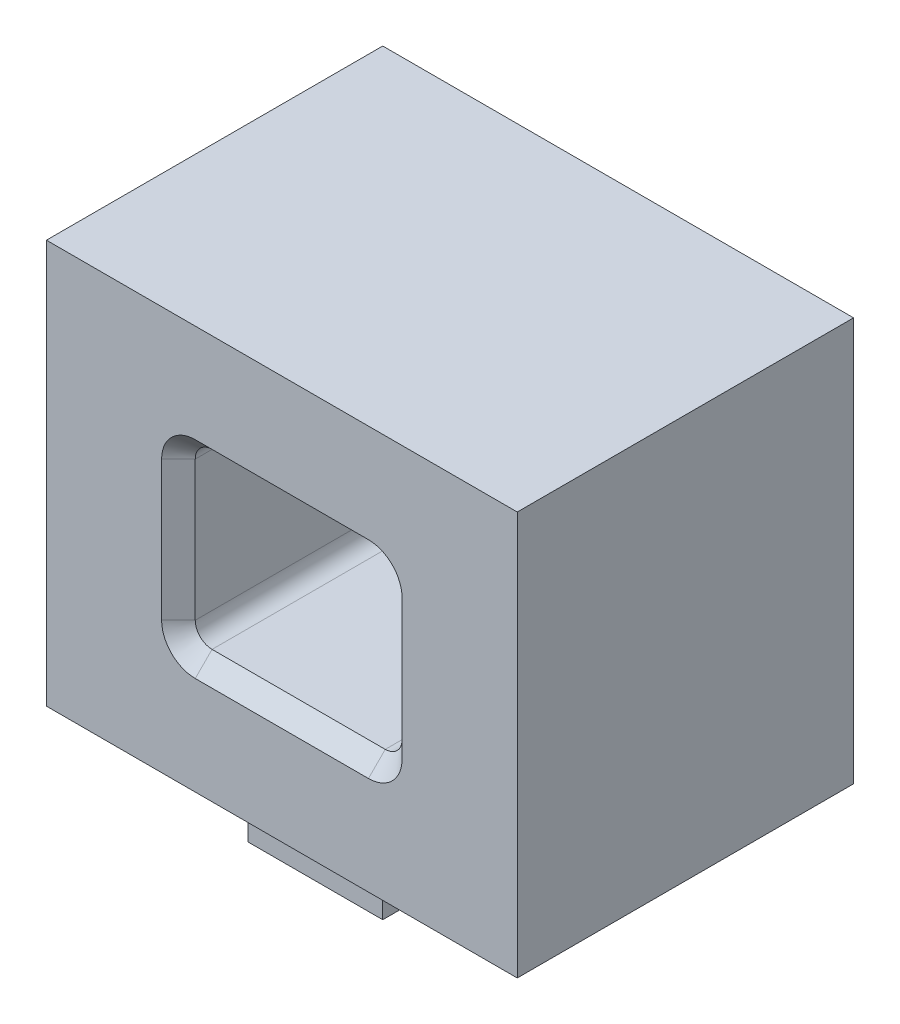
ISO-10303-21;
HEADER;
FILE_DESCRIPTION(('STEP AP214'),'2;1');
FILE_NAME('part.step','',(''),(''),'','','');
FILE_SCHEMA(('AUTOMOTIVE_DESIGN { 1 0 10303 214 1 1 1 1 }'));
ENDSEC;
DATA;
#1=APPLICATION_CONTEXT('core data for automotive mechanical design processes');
#2=APPLICATION_PROTOCOL_DEFINITION('international standard','automotive_design',2000,#1);
#3=PRODUCT_CONTEXT('',#1,'mechanical');
#4=PRODUCT('Part','Part','',(#3));
#5=PRODUCT_RELATED_PRODUCT_CATEGORY('part','',(#4));
#6=PRODUCT_DEFINITION_FORMATION('','',#4);
#7=PRODUCT_DEFINITION_CONTEXT('part definition',#1,'design');
#8=PRODUCT_DEFINITION('design','',#6,#7);
#9=PRODUCT_DEFINITION_SHAPE('','',#8);
#10=(LENGTH_UNIT() NAMED_UNIT(*) SI_UNIT(.MILLI.,.METRE.));
#11=(NAMED_UNIT(*) PLANE_ANGLE_UNIT() SI_UNIT($,.RADIAN.));
#12=(NAMED_UNIT(*) SI_UNIT($,.STERADIAN.) SOLID_ANGLE_UNIT());
#13=UNCERTAINTY_MEASURE_WITH_UNIT(LENGTH_MEASURE(1.E-05),#10,'distance_accuracy_value','');
#14=(GEOMETRIC_REPRESENTATION_CONTEXT(3) GLOBAL_UNCERTAINTY_ASSIGNED_CONTEXT((#13)) GLOBAL_UNIT_ASSIGNED_CONTEXT((#10,
#11,#12)) REPRESENTATION_CONTEXT('',''));
#15=CARTESIAN_POINT('',(0.,0.,0.));
#16=DIRECTION('',(0.,0.,1.));
#17=DIRECTION('',(1.,0.,0.));
#18=AXIS2_PLACEMENT_3D('',#15,#16,#17);
#19=CARTESIAN_POINT('',(0.,0.,20.));
#20=DIRECTION('',(0.,0.,-1.));
#21=DIRECTION('',(-1.,0.,0.));
#22=AXIS2_PLACEMENT_3D('',#19,#20,#21);
#23=PLANE('',#22);
#24=CARTESIAN_POINT('',(-5.15,4.15,20.));
#25=DIRECTION('',(0.,0.,-1.));
#26=DIRECTION('',(-1.,0.,0.));
#27=AXIS2_PLACEMENT_3D('',#24,#25,#26);
#28=CIRCLE('',#27,2.00000000000001);
#29=CARTESIAN_POINT('',(-7.15000000000001,4.15,20.));
#30=VERTEX_POINT('',#29);
#31=CARTESIAN_POINT('',(-5.15,6.15000000000001,20.));
#32=VERTEX_POINT('',#31);
#33=EDGE_CURVE('E368',#30,#32,#28,.T.);
#34=ORIENTED_EDGE('',*,*,#33,.T.);
#35=DIRECTION('',(1.,0.,0.));
#36=VECTOR('',#35,1.);
#37=CARTESIAN_POINT('',(5.15,6.15000000000001,20.));
#38=LINE('',#37,#36);
#39=CARTESIAN_POINT('',(5.15,6.15000000000001,20.));
#40=VERTEX_POINT('',#39);
#41=EDGE_CURVE('E366',#32,#40,#38,.T.);
#42=ORIENTED_EDGE('',*,*,#41,.T.);
#43=CARTESIAN_POINT('',(5.15,4.15,20.));
#44=DIRECTION('',(0.,0.,-1.));
#45=DIRECTION('',(-1.,0.,0.));
#46=AXIS2_PLACEMENT_3D('',#43,#44,#45);
#47=CIRCLE('',#46,2.00000000000001);
#48=CARTESIAN_POINT('',(7.15000000000001,4.15,20.));
#49=VERTEX_POINT('',#48);
#50=EDGE_CURVE('E365',#40,#49,#47,.T.);
#51=ORIENTED_EDGE('',*,*,#50,.T.);
#52=DIRECTION('',(0.,-1.,0.));
#53=VECTOR('',#52,1.);
#54=CARTESIAN_POINT('',(7.15000000000001,0.,20.));
#55=LINE('',#54,#53);
#56=CARTESIAN_POINT('',(7.15000000000001,-4.15,20.));
#57=VERTEX_POINT('',#56);
#58=EDGE_CURVE('E356',#49,#57,#55,.T.);
#59=ORIENTED_EDGE('',*,*,#58,.T.);
#60=CARTESIAN_POINT('',(5.15,-4.15,20.));
#61=DIRECTION('',(0.,0.,-1.));
#62=DIRECTION('',(-1.,0.,0.));
#63=AXIS2_PLACEMENT_3D('',#60,#61,#62);
#64=CIRCLE('',#63,2.00000000000001);
#65=CARTESIAN_POINT('',(5.15,-6.15000000000001,20.));
#66=VERTEX_POINT('',#65);
#67=EDGE_CURVE('E357',#57,#66,#64,.T.);
#68=ORIENTED_EDGE('',*,*,#67,.T.);
#69=DIRECTION('',(-1.,0.,0.));
#70=VECTOR('',#69,1.);
#71=CARTESIAN_POINT('',(0.,-6.15000000000001,20.));
#72=LINE('',#71,#70);
#73=CARTESIAN_POINT('',(-5.15,-6.15000000000001,20.));
#74=VERTEX_POINT('',#73);
#75=EDGE_CURVE('E353',#66,#74,#72,.T.);
#76=ORIENTED_EDGE('',*,*,#75,.T.);
#77=CARTESIAN_POINT('',(-5.15,-4.15,20.));
#78=DIRECTION('',(0.,0.,-1.));
#79=DIRECTION('',(-1.,0.,0.));
#80=AXIS2_PLACEMENT_3D('',#77,#78,#79);
#81=CIRCLE('',#80,2.00000000000001);
#82=CARTESIAN_POINT('',(-7.15000000000001,-4.15,20.));
#83=VERTEX_POINT('',#82);
#84=EDGE_CURVE('E358',#74,#83,#81,.T.);
#85=ORIENTED_EDGE('',*,*,#84,.T.);
#86=DIRECTION('',(0.,1.,0.));
#87=VECTOR('',#86,1.);
#88=CARTESIAN_POINT('',(-7.15000000000001,4.15,20.));
#89=LINE('',#88,#87);
#90=EDGE_CURVE('E362',#83,#30,#89,.T.);
#91=ORIENTED_EDGE('',*,*,#90,.T.);
#92=EDGE_LOOP('',(#34,#42,#51,#59,#68,#76,#85,#91));
#93=FACE_BOUND('',#92,.T.);
#94=DIRECTION('',(0.,1.,0.));
#95=VECTOR('',#94,1.);
#96=CARTESIAN_POINT('',(14.,-12.,20.));
#97=LINE('',#96,#95);
#98=CARTESIAN_POINT('',(14.,-12.,20.));
#99=VERTEX_POINT('',#98);
#100=CARTESIAN_POINT('',(14.,12.,20.));
#101=VERTEX_POINT('',#100);
#102=EDGE_CURVE('E296',#99,#101,#97,.T.);
#103=ORIENTED_EDGE('',*,*,#102,.T.);
#104=DIRECTION('',(-1.,0.,0.));
#105=VECTOR('',#104,1.);
#106=CARTESIAN_POINT('',(-14.,12.,20.));
#107=LINE('',#106,#105);
#108=CARTESIAN_POINT('',(-14.,12.,20.));
#109=VERTEX_POINT('',#108);
#110=EDGE_CURVE('E297',#101,#109,#107,.T.);
#111=ORIENTED_EDGE('',*,*,#110,.T.);
#112=DIRECTION('',(0.,-1.,0.));
#113=VECTOR('',#112,1.);
#114=CARTESIAN_POINT('',(-14.,-12.,20.));
#115=LINE('',#114,#113);
#116=CARTESIAN_POINT('',(-14.,-12.,20.));
#117=VERTEX_POINT('',#116);
#118=EDGE_CURVE('E303',#109,#117,#115,.T.);
#119=ORIENTED_EDGE('',*,*,#118,.T.);
#120=DIRECTION('',(1.,0.,0.));
#121=VECTOR('',#120,1.);
#122=CARTESIAN_POINT('',(-14.,-12.,20.));
#123=LINE('',#122,#121);
#124=EDGE_CURVE('E301',#117,#99,#123,.T.);
#125=ORIENTED_EDGE('',*,*,#124,.T.);
#126=EDGE_LOOP('',(#103,#111,#119,#125));
#127=FACE_BOUND('',#126,.T.);
#128=ADVANCED_FACE('F41',(#93,#127),#23,.F.);
#129=CARTESIAN_POINT('',(14.,-12.,20.));
#130=DIRECTION('',(-1.,0.,0.));
#131=DIRECTION('',(0.,0.,1.));
#132=AXIS2_PLACEMENT_3D('',#129,#130,#131);
#133=PLANE('',#132);
#134=DIRECTION('',(0.,1.,0.));
#135=VECTOR('',#134,1.);
#136=CARTESIAN_POINT('',(14.,-12.,0.));
#137=LINE('',#136,#135);
#138=CARTESIAN_POINT('',(14.,-12.,0.));
#139=VERTEX_POINT('',#138);
#140=CARTESIAN_POINT('',(14.,12.,0.));
#141=VERTEX_POINT('',#140);
#142=EDGE_CURVE('E299',#139,#141,#137,.T.);
#143=ORIENTED_EDGE('',*,*,#142,.T.);
#144=DIRECTION('',(0.,0.,-1.));
#145=VECTOR('',#144,1.);
#146=CARTESIAN_POINT('',(14.,12.,20.));
#147=LINE('',#146,#145);
#148=EDGE_CURVE('E323',#101,#141,#147,.T.);
#149=ORIENTED_EDGE('',*,*,#148,.F.);
#150=ORIENTED_EDGE('',*,*,#102,.F.);
#151=DIRECTION('',(0.,0.,-1.));
#152=VECTOR('',#151,1.);
#153=CARTESIAN_POINT('',(14.,-12.,20.));
#154=LINE('',#153,#152);
#155=EDGE_CURVE('E307',#99,#139,#154,.T.);
#156=ORIENTED_EDGE('',*,*,#155,.T.);
#157=EDGE_LOOP('',(#143,#149,#150,#156));
#158=FACE_BOUND('',#157,.T.);
#159=ADVANCED_FACE('F483',(#158),#133,.F.);
#160=CARTESIAN_POINT('',(-14.,12.,20.));
#161=DIRECTION('',(0.,-1.,0.));
#162=DIRECTION('',(0.,0.,-1.));
#163=AXIS2_PLACEMENT_3D('',#160,#161,#162);
#164=PLANE('',#163);
#165=DIRECTION('',(-1.,0.,0.));
#166=VECTOR('',#165,1.);
#167=CARTESIAN_POINT('',(-14.,12.,0.));
#168=LINE('',#167,#166);
#169=CARTESIAN_POINT('',(-14.,12.,0.));
#170=VERTEX_POINT('',#169);
#171=EDGE_CURVE('E309',#141,#170,#168,.T.);
#172=ORIENTED_EDGE('',*,*,#171,.T.);
#173=DIRECTION('',(0.,0.,-1.));
#174=VECTOR('',#173,1.);
#175=CARTESIAN_POINT('',(-14.,12.,20.));
#176=LINE('',#175,#174);
#177=EDGE_CURVE('E319',#109,#170,#176,.T.);
#178=ORIENTED_EDGE('',*,*,#177,.F.);
#179=ORIENTED_EDGE('',*,*,#110,.F.);
#180=ORIENTED_EDGE('',*,*,#148,.T.);
#181=EDGE_LOOP('',(#172,#178,#179,#180));
#182=FACE_BOUND('',#181,.T.);
#183=ADVANCED_FACE('F491',(#182),#164,.F.);
#184=CARTESIAN_POINT('',(-14.,-12.,20.));
#185=DIRECTION('',(1.,0.,0.));
#186=DIRECTION('',(0.,0.,-1.));
#187=AXIS2_PLACEMENT_3D('',#184,#185,#186);
#188=PLANE('',#187);
#189=DIRECTION('',(0.,-1.,0.));
#190=VECTOR('',#189,1.);
#191=CARTESIAN_POINT('',(-14.,-12.,0.));
#192=LINE('',#191,#190);
#193=CARTESIAN_POINT('',(-14.,-12.,0.));
#194=VERTEX_POINT('',#193);
#195=EDGE_CURVE('E315',#170,#194,#192,.T.);
#196=ORIENTED_EDGE('',*,*,#195,.T.);
#197=DIRECTION('',(0.,0.,-1.));
#198=VECTOR('',#197,1.);
#199=CARTESIAN_POINT('',(-14.,-12.,20.));
#200=LINE('',#199,#198);
#201=EDGE_CURVE('E320',#117,#194,#200,.T.);
#202=ORIENTED_EDGE('',*,*,#201,.F.);
#203=ORIENTED_EDGE('',*,*,#118,.F.);
#204=ORIENTED_EDGE('',*,*,#177,.T.);
#205=EDGE_LOOP('',(#196,#202,#203,#204));
#206=FACE_BOUND('',#205,.T.);
#207=ADVANCED_FACE('F502',(#206),#188,.F.);
#208=CARTESIAN_POINT('',(-14.,-12.,20.));
#209=DIRECTION('',(0.,1.,0.));
#210=DIRECTION('',(0.,0.,1.));
#211=AXIS2_PLACEMENT_3D('',#208,#209,#210);
#212=PLANE('',#211);
#213=DIRECTION('',(1.,0.,0.));
#214=VECTOR('',#213,1.);
#215=CARTESIAN_POINT('',(-4.,-12.,0.999999999999998));
#216=LINE('',#215,#214);
#217=CARTESIAN_POINT('',(5.,-12.,0.999999999999998));
#218=VERTEX_POINT('',#217);
#219=CARTESIAN_POINT('',(-5.,-12.,0.999999999999998));
#220=VERTEX_POINT('',#219);
#221=EDGE_CURVE('E424',#218,#220,#216,.F.);
#222=ORIENTED_EDGE('',*,*,#221,.T.);
#223=DIRECTION('',(0.,0.,-1.));
#224=VECTOR('',#223,1.);
#225=CARTESIAN_POINT('',(-5.,-12.,8.));
#226=LINE('',#225,#224);
#227=CARTESIAN_POINT('',(-5.,-12.,9.));
#228=VERTEX_POINT('',#227);
#229=EDGE_CURVE('E428',#220,#228,#226,.F.);
#230=ORIENTED_EDGE('',*,*,#229,.T.);
#231=DIRECTION('',(-1.,0.,0.));
#232=VECTOR('',#231,1.);
#233=CARTESIAN_POINT('',(4.,-12.,9.));
#234=LINE('',#233,#232);
#235=CARTESIAN_POINT('',(5.,-12.,9.));
#236=VERTEX_POINT('',#235);
#237=EDGE_CURVE('E426',#228,#236,#234,.F.);
#238=ORIENTED_EDGE('',*,*,#237,.T.);
#239=DIRECTION('',(0.,0.,1.));
#240=VECTOR('',#239,1.);
#241=CARTESIAN_POINT('',(5.,-12.,2.));
#242=LINE('',#241,#240);
#243=EDGE_CURVE('E425',#236,#218,#242,.F.);
#244=ORIENTED_EDGE('',*,*,#243,.T.);
#245=EDGE_LOOP('',(#222,#230,#238,#244));
#246=FACE_BOUND('',#245,.T.);
#247=DIRECTION('',(-1.,0.,0.));
#248=VECTOR('',#247,1.);
#249=CARTESIAN_POINT('',(4.,-12.,19.));
#250=LINE('',#249,#248);
#251=CARTESIAN_POINT('',(-5.,-12.,19.));
#252=VERTEX_POINT('',#251);
#253=CARTESIAN_POINT('',(5.,-12.,19.));
#254=VERTEX_POINT('',#253);
#255=EDGE_CURVE('E413',#252,#254,#250,.F.);
#256=ORIENTED_EDGE('',*,*,#255,.T.);
#257=DIRECTION('',(0.,0.,1.));
#258=VECTOR('',#257,1.);
#259=CARTESIAN_POINT('',(5.,-12.,12.));
#260=LINE('',#259,#258);
#261=CARTESIAN_POINT('',(5.,-12.,11.));
#262=VERTEX_POINT('',#261);
#263=EDGE_CURVE('E420',#254,#262,#260,.F.);
#264=ORIENTED_EDGE('',*,*,#263,.T.);
#265=DIRECTION('',(1.,0.,0.));
#266=VECTOR('',#265,1.);
#267=CARTESIAN_POINT('',(-4.,-12.,11.));
#268=LINE('',#267,#266);
#269=CARTESIAN_POINT('',(-5.,-12.,11.));
#270=VERTEX_POINT('',#269);
#271=EDGE_CURVE('E417',#262,#270,#268,.F.);
#272=ORIENTED_EDGE('',*,*,#271,.T.);
#273=DIRECTION('',(0.,0.,-1.));
#274=VECTOR('',#273,1.);
#275=CARTESIAN_POINT('',(-5.,-12.,18.));
#276=LINE('',#275,#274);
#277=EDGE_CURVE('E411',#270,#252,#276,.F.);
#278=ORIENTED_EDGE('',*,*,#277,.T.);
#279=EDGE_LOOP('',(#256,#264,#272,#278));
#280=FACE_BOUND('',#279,.T.);
#281=DIRECTION('',(1.,0.,0.));
#282=VECTOR('',#281,1.);
#283=CARTESIAN_POINT('',(-14.,-12.,0.));
#284=LINE('',#283,#282);
#285=EDGE_CURVE('E302',#194,#139,#284,.T.);
#286=ORIENTED_EDGE('',*,*,#285,.T.);
#287=ORIENTED_EDGE('',*,*,#155,.F.);
#288=ORIENTED_EDGE('',*,*,#124,.F.);
#289=ORIENTED_EDGE('',*,*,#201,.T.);
#290=EDGE_LOOP('',(#286,#287,#288,#289));
#291=FACE_BOUND('',#290,.T.);
#292=ADVANCED_FACE('F468',(#246,#280,#291),#212,.F.);
#293=CARTESIAN_POINT('',(0.,0.,0.));
#294=DIRECTION('',(0.,0.,-1.));
#295=DIRECTION('',(-1.,0.,0.));
#296=AXIS2_PLACEMENT_3D('',#293,#294,#295);
#297=PLANE('',#296);
#298=ORIENTED_EDGE('',*,*,#142,.F.);
#299=ORIENTED_EDGE('',*,*,#285,.F.);
#300=ORIENTED_EDGE('',*,*,#195,.F.);
#301=ORIENTED_EDGE('',*,*,#171,.F.);
#302=EDGE_LOOP('',(#298,#299,#300,#301));
#303=FACE_BOUND('',#302,.T.);
#304=ADVANCED_FACE('F496',(#303),#297,.T.);
#305=CARTESIAN_POINT('',(-6.15,5.15,4.7));
#306=DIRECTION('',(0.,-1.,0.));
#307=DIRECTION('',(0.,0.,-1.));
#308=AXIS2_PLACEMENT_3D('',#305,#306,#307);
#309=PLANE('',#308);
#310=DIRECTION('',(0.,0.,1.));
#311=VECTOR('',#310,1.);
#312=CARTESIAN_POINT('',(5.15,5.15,4.7));
#313=LINE('',#312,#311);
#314=CARTESIAN_POINT('',(5.15,5.15,4.7));
#315=VERTEX_POINT('',#314);
#316=CARTESIAN_POINT('',(5.15,5.15,19.));
#317=VERTEX_POINT('',#316);
#318=EDGE_CURVE('E347',#315,#317,#313,.T.);
#319=ORIENTED_EDGE('',*,*,#318,.T.);
#320=DIRECTION('',(-1.,0.,0.));
#321=VECTOR('',#320,1.);
#322=CARTESIAN_POINT('',(-5.15,5.15,19.));
#323=LINE('',#322,#321);
#324=CARTESIAN_POINT('',(-5.15,5.15,19.));
#325=VERTEX_POINT('',#324);
#326=EDGE_CURVE('E371',#317,#325,#323,.T.);
#327=ORIENTED_EDGE('',*,*,#326,.T.);
#328=DIRECTION('',(0.,0.,1.));
#329=VECTOR('',#328,1.);
#330=CARTESIAN_POINT('',(-5.15,5.15,4.7));
#331=LINE('',#330,#329);
#332=CARTESIAN_POINT('',(-5.15,5.15,4.7));
#333=VERTEX_POINT('',#332);
#334=EDGE_CURVE('E344',#325,#333,#331,.F.);
#335=ORIENTED_EDGE('',*,*,#334,.T.);
#336=DIRECTION('',(1.,0.,0.));
#337=VECTOR('',#336,1.);
#338=CARTESIAN_POINT('',(-6.15,5.15,4.7));
#339=LINE('',#338,#337);
#340=EDGE_CURVE('E246',#333,#315,#339,.T.);
#341=ORIENTED_EDGE('',*,*,#340,.T.);
#342=EDGE_LOOP('',(#319,#327,#335,#341));
#343=FACE_BOUND('',#342,.T.);
#344=ADVANCED_FACE('F500',(#343),#309,.T.);
#345=CARTESIAN_POINT('',(6.15,-5.15,4.7));
#346=DIRECTION('',(1.,0.,0.));
#347=DIRECTION('',(0.,0.,-1.));
#348=AXIS2_PLACEMENT_3D('',#345,#346,#347);
#349=PLANE('',#348);
#350=DIRECTION('',(0.,0.,1.));
#351=VECTOR('',#350,1.);
#352=CARTESIAN_POINT('',(6.15,-4.15,20.));
#353=LINE('',#352,#351);
#354=CARTESIAN_POINT('',(6.15,-4.15,4.7));
#355=VERTEX_POINT('',#354);
#356=CARTESIAN_POINT('',(6.15,-4.15,19.));
#357=VERTEX_POINT('',#356);
#358=EDGE_CURVE('E327',#355,#357,#353,.T.);
#359=ORIENTED_EDGE('',*,*,#358,.T.);
#360=DIRECTION('',(0.,1.,0.));
#361=VECTOR('',#360,1.);
#362=CARTESIAN_POINT('',(6.15,-5.15,19.));
#363=LINE('',#362,#361);
#364=CARTESIAN_POINT('',(6.15,4.15,19.));
#365=VERTEX_POINT('',#364);
#366=EDGE_CURVE('E379',#357,#365,#363,.T.);
#367=ORIENTED_EDGE('',*,*,#366,.T.);
#368=DIRECTION('',(0.,0.,1.));
#369=VECTOR('',#368,1.);
#370=CARTESIAN_POINT('',(6.15,4.15,4.7));
#371=LINE('',#370,#369);
#372=CARTESIAN_POINT('',(6.15,4.15,4.7));
#373=VERTEX_POINT('',#372);
#374=EDGE_CURVE('E326',#365,#373,#371,.F.);
#375=ORIENTED_EDGE('',*,*,#374,.T.);
#376=DIRECTION('',(0.,1.,0.));
#377=VECTOR('',#376,1.);
#378=CARTESIAN_POINT('',(6.15,-5.15,4.7));
#379=LINE('',#378,#377);
#380=EDGE_CURVE('E251',#355,#373,#379,.T.);
#381=ORIENTED_EDGE('',*,*,#380,.F.);
#382=EDGE_LOOP('',(#359,#367,#375,#381));
#383=FACE_BOUND('',#382,.T.);
#384=ADVANCED_FACE('F665',(#383),#349,.F.);
#385=CARTESIAN_POINT('',(-6.15,-5.15,4.7));
#386=DIRECTION('',(0.,-1.,0.));
#387=DIRECTION('',(0.,0.,-1.));
#388=AXIS2_PLACEMENT_3D('',#385,#386,#387);
#389=PLANE('',#388);
#390=DIRECTION('',(0.,0.,1.));
#391=VECTOR('',#390,1.);
#392=CARTESIAN_POINT('',(-5.15,-5.15,4.7));
#393=LINE('',#392,#391);
#394=CARTESIAN_POINT('',(-5.15,-5.15,4.7));
#395=VERTEX_POINT('',#394);
#396=CARTESIAN_POINT('',(-5.15,-5.15,19.));
#397=VERTEX_POINT('',#396);
#398=EDGE_CURVE('E332',#395,#397,#393,.T.);
#399=ORIENTED_EDGE('',*,*,#398,.T.);
#400=DIRECTION('',(1.,0.,0.));
#401=VECTOR('',#400,1.);
#402=CARTESIAN_POINT('',(-6.15,-5.15,19.));
#403=LINE('',#402,#401);
#404=CARTESIAN_POINT('',(5.15,-5.15,19.));
#405=VERTEX_POINT('',#404);
#406=EDGE_CURVE('E387',#397,#405,#403,.T.);
#407=ORIENTED_EDGE('',*,*,#406,.T.);
#408=DIRECTION('',(0.,0.,1.));
#409=VECTOR('',#408,1.);
#410=CARTESIAN_POINT('',(5.15,-5.15,4.7));
#411=LINE('',#410,#409);
#412=CARTESIAN_POINT('',(5.15,-5.15,4.7));
#413=VERTEX_POINT('',#412);
#414=EDGE_CURVE('E331',#405,#413,#411,.F.);
#415=ORIENTED_EDGE('',*,*,#414,.T.);
#416=DIRECTION('',(1.,0.,0.));
#417=VECTOR('',#416,1.);
#418=CARTESIAN_POINT('',(-6.15,-5.15,4.7));
#419=LINE('',#418,#417);
#420=EDGE_CURVE('E286',#395,#413,#419,.T.);
#421=ORIENTED_EDGE('',*,*,#420,.F.);
#422=EDGE_LOOP('',(#399,#407,#415,#421));
#423=FACE_BOUND('',#422,.T.);
#424=ADVANCED_FACE('F658',(#423),#389,.F.);
#425=CARTESIAN_POINT('',(-6.15,-5.15,4.7));
#426=DIRECTION('',(1.,0.,0.));
#427=DIRECTION('',(0.,0.,-1.));
#428=AXIS2_PLACEMENT_3D('',#425,#426,#427);
#429=PLANE('',#428);
#430=DIRECTION('',(0.,0.,1.));
#431=VECTOR('',#430,1.);
#432=CARTESIAN_POINT('',(-6.15,4.15,20.));
#433=LINE('',#432,#431);
#434=CARTESIAN_POINT('',(-6.15,4.15,4.7));
#435=VERTEX_POINT('',#434);
#436=CARTESIAN_POINT('',(-6.15,4.15,19.));
#437=VERTEX_POINT('',#436);
#438=EDGE_CURVE('E354',#435,#437,#433,.T.);
#439=ORIENTED_EDGE('',*,*,#438,.T.);
#440=DIRECTION('',(0.,-1.,0.));
#441=VECTOR('',#440,1.);
#442=CARTESIAN_POINT('',(-6.15,-4.15,19.));
#443=LINE('',#442,#441);
#444=CARTESIAN_POINT('',(-6.15,-4.15,19.));
#445=VERTEX_POINT('',#444);
#446=EDGE_CURVE('E378',#437,#445,#443,.T.);
#447=ORIENTED_EDGE('',*,*,#446,.T.);
#448=DIRECTION('',(0.,0.,1.));
#449=VECTOR('',#448,1.);
#450=CARTESIAN_POINT('',(-6.15,-4.15,4.7));
#451=LINE('',#450,#449);
#452=CARTESIAN_POINT('',(-6.15,-4.15,4.7));
#453=VERTEX_POINT('',#452);
#454=EDGE_CURVE('E349',#445,#453,#451,.F.);
#455=ORIENTED_EDGE('',*,*,#454,.T.);
#456=DIRECTION('',(0.,1.,0.));
#457=VECTOR('',#456,1.);
#458=CARTESIAN_POINT('',(-6.15,-5.15,4.7));
#459=LINE('',#458,#457);
#460=EDGE_CURVE('E291',#453,#435,#459,.T.);
#461=ORIENTED_EDGE('',*,*,#460,.T.);
#462=EDGE_LOOP('',(#439,#447,#455,#461));
#463=FACE_BOUND('',#462,.T.);
#464=ADVANCED_FACE('F654',(#463),#429,.T.);
#465=CARTESIAN_POINT('',(0.,0.,4.7));
#466=DIRECTION('',(0.,0.,1.));
#467=DIRECTION('',(1.,0.,0.));
#468=AXIS2_PLACEMENT_3D('',#465,#466,#467);
#469=PLANE('',#468);
#470=ORIENTED_EDGE('',*,*,#420,.T.);
#471=CARTESIAN_POINT('',(5.15,-4.15,4.7));
#472=DIRECTION('',(0.,0.,1.));
#473=DIRECTION('',(1.,0.,0.));
#474=AXIS2_PLACEMENT_3D('',#471,#472,#473);
#475=CIRCLE('',#474,1.);
#476=EDGE_CURVE('E345',#413,#355,#475,.T.);
#477=ORIENTED_EDGE('',*,*,#476,.T.);
#478=ORIENTED_EDGE('',*,*,#380,.T.);
#479=CARTESIAN_POINT('',(5.15,4.15,4.7));
#480=DIRECTION('',(0.,0.,1.));
#481=DIRECTION('',(1.,0.,0.));
#482=AXIS2_PLACEMENT_3D('',#479,#480,#481);
#483=CIRCLE('',#482,1.);
#484=EDGE_CURVE('E337',#373,#315,#483,.T.);
#485=ORIENTED_EDGE('',*,*,#484,.T.);
#486=ORIENTED_EDGE('',*,*,#340,.F.);
#487=CARTESIAN_POINT('',(-5.15,4.15,4.7));
#488=DIRECTION('',(0.,0.,1.));
#489=DIRECTION('',(1.,0.,0.));
#490=AXIS2_PLACEMENT_3D('',#487,#488,#489);
#491=CIRCLE('',#490,1.);
#492=EDGE_CURVE('E340',#333,#435,#491,.T.);
#493=ORIENTED_EDGE('',*,*,#492,.T.);
#494=ORIENTED_EDGE('',*,*,#460,.F.);
#495=CARTESIAN_POINT('',(-5.15,-4.15,4.7));
#496=DIRECTION('',(0.,0.,1.));
#497=DIRECTION('',(1.,0.,0.));
#498=AXIS2_PLACEMENT_3D('',#495,#496,#497);
#499=CIRCLE('',#498,1.);
#500=EDGE_CURVE('E339',#453,#395,#499,.T.);
#501=ORIENTED_EDGE('',*,*,#500,.T.);
#502=EDGE_LOOP('',(#470,#477,#478,#485,#486,#493,#494,#501));
#503=FACE_BOUND('',#502,.T.);
#504=ADVANCED_FACE('F649',(#503),#469,.T.);
#505=CARTESIAN_POINT('',(0.,-15.,0.));
#506=DIRECTION('',(0.,-1.,0.));
#507=DIRECTION('',(0.,0.,-1.));
#508=AXIS2_PLACEMENT_3D('',#505,#506,#507);
#509=PLANE('',#508);
#510=DIRECTION('',(0.,0.,-1.));
#511=VECTOR('',#510,1.);
#512=CARTESIAN_POINT('',(-4.,-15.,8.));
#513=LINE('',#512,#511);
#514=CARTESIAN_POINT('',(-4.,-15.,8.));
#515=VERTEX_POINT('',#514);
#516=CARTESIAN_POINT('',(-4.,-15.,2.));
#517=VERTEX_POINT('',#516);
#518=EDGE_CURVE('E279',#515,#517,#513,.T.);
#519=ORIENTED_EDGE('',*,*,#518,.T.);
#520=DIRECTION('',(1.,0.,0.));
#521=VECTOR('',#520,1.);
#522=CARTESIAN_POINT('',(-4.,-15.,2.));
#523=LINE('',#522,#521);
#524=CARTESIAN_POINT('',(4.,-15.,2.));
#525=VERTEX_POINT('',#524);
#526=EDGE_CURVE('E277',#517,#525,#523,.T.);
#527=ORIENTED_EDGE('',*,*,#526,.T.);
#528=DIRECTION('',(0.,0.,1.));
#529=VECTOR('',#528,1.);
#530=CARTESIAN_POINT('',(4.,-15.,8.));
#531=LINE('',#530,#529);
#532=CARTESIAN_POINT('',(4.,-15.,8.));
#533=VERTEX_POINT('',#532);
#534=EDGE_CURVE('E273',#525,#533,#531,.T.);
#535=ORIENTED_EDGE('',*,*,#534,.T.);
#536=DIRECTION('',(-1.,0.,0.));
#537=VECTOR('',#536,1.);
#538=CARTESIAN_POINT('',(-4.,-15.,8.));
#539=LINE('',#538,#537);
#540=EDGE_CURVE('E275',#533,#515,#539,.T.);
#541=ORIENTED_EDGE('',*,*,#540,.T.);
#542=EDGE_LOOP('',(#519,#527,#535,#541));
#543=FACE_BOUND('',#542,.T.);
#544=CARTESIAN_POINT('',(0.,-15.,5.));
#545=DIRECTION('',(0.,-1.,0.));
#546=DIRECTION('',(0.,0.,1.));
#547=AXIS2_PLACEMENT_3D('',#544,#545,#546);
#548=CIRCLE('',#547,1.7);
#549=CARTESIAN_POINT('',(0.,-15.,6.7));
#550=VERTEX_POINT('',#549);
#551=EDGE_CURVE('E284',#550,#550,#548,.T.);
#552=ORIENTED_EDGE('',*,*,#551,.F.);
#553=EDGE_LOOP('',(#552));
#554=FACE_BOUND('',#553,.T.);
#555=ADVANCED_FACE('F626',(#543,#554),#509,.T.);
#556=CARTESIAN_POINT('',(-4.,-15.,8.));
#557=DIRECTION('',(1.,0.,0.));
#558=DIRECTION('',(0.,0.,-1.));
#559=AXIS2_PLACEMENT_3D('',#556,#557,#558);
#560=PLANE('',#559);
#561=DIRECTION('',(0.,1.,0.));
#562=VECTOR('',#561,1.);
#563=CARTESIAN_POINT('',(-4.,-15.,8.));
#564=LINE('',#563,#562);
#565=CARTESIAN_POINT('',(-4.,-13.,8.));
#566=VERTEX_POINT('',#565);
#567=EDGE_CURVE('E267',#515,#566,#564,.T.);
#568=ORIENTED_EDGE('',*,*,#567,.T.);
#569=DIRECTION('',(0.,0.,-1.));
#570=VECTOR('',#569,1.);
#571=CARTESIAN_POINT('',(-4.,-13.,2.));
#572=LINE('',#571,#570);
#573=CARTESIAN_POINT('',(-4.,-13.,2.));
#574=VERTEX_POINT('',#573);
#575=EDGE_CURVE('E389',#566,#574,#572,.T.);
#576=ORIENTED_EDGE('',*,*,#575,.T.);
#577=DIRECTION('',(0.,1.,0.));
#578=VECTOR('',#577,1.);
#579=CARTESIAN_POINT('',(-4.,-15.,2.));
#580=LINE('',#579,#578);
#581=EDGE_CURVE('E259',#517,#574,#580,.T.);
#582=ORIENTED_EDGE('',*,*,#581,.F.);
#583=ORIENTED_EDGE('',*,*,#518,.F.);
#584=EDGE_LOOP('',(#568,#576,#582,#583));
#585=FACE_BOUND('',#584,.T.);
#586=ADVANCED_FACE('F624',(#585),#560,.F.);
#587=CARTESIAN_POINT('',(-4.,-15.,2.));
#588=DIRECTION('',(0.,0.,1.));
#589=DIRECTION('',(1.,0.,0.));
#590=AXIS2_PLACEMENT_3D('',#587,#588,#589);
#591=PLANE('',#590);
#592=ORIENTED_EDGE('',*,*,#581,.T.);
#593=DIRECTION('',(1.,0.,0.));
#594=VECTOR('',#593,1.);
#595=CARTESIAN_POINT('',(4.,-13.,2.));
#596=LINE('',#595,#594);
#597=CARTESIAN_POINT('',(4.,-13.,2.));
#598=VERTEX_POINT('',#597);
#599=EDGE_CURVE('E433',#574,#598,#596,.T.);
#600=ORIENTED_EDGE('',*,*,#599,.T.);
#601=DIRECTION('',(0.,1.,0.));
#602=VECTOR('',#601,1.);
#603=CARTESIAN_POINT('',(4.,-15.,2.));
#604=LINE('',#603,#602);
#605=EDGE_CURVE('E265',#525,#598,#604,.T.);
#606=ORIENTED_EDGE('',*,*,#605,.F.);
#607=ORIENTED_EDGE('',*,*,#526,.F.);
#608=EDGE_LOOP('',(#592,#600,#606,#607));
#609=FACE_BOUND('',#608,.T.);
#610=ADVANCED_FACE('F634',(#609),#591,.F.);
#611=CARTESIAN_POINT('',(4.,-15.,8.));
#612=DIRECTION('',(-1.,0.,0.));
#613=DIRECTION('',(0.,0.,1.));
#614=AXIS2_PLACEMENT_3D('',#611,#612,#613);
#615=PLANE('',#614);
#616=ORIENTED_EDGE('',*,*,#605,.T.);
#617=DIRECTION('',(0.,0.,1.));
#618=VECTOR('',#617,1.);
#619=CARTESIAN_POINT('',(4.,-13.,8.));
#620=LINE('',#619,#618);
#621=CARTESIAN_POINT('',(4.,-13.,8.));
#622=VERTEX_POINT('',#621);
#623=EDGE_CURVE('E434',#598,#622,#620,.T.);
#624=ORIENTED_EDGE('',*,*,#623,.T.);
#625=DIRECTION('',(0.,1.,0.));
#626=VECTOR('',#625,1.);
#627=CARTESIAN_POINT('',(4.,-15.,8.));
#628=LINE('',#627,#626);
#629=EDGE_CURVE('E266',#533,#622,#628,.T.);
#630=ORIENTED_EDGE('',*,*,#629,.F.);
#631=ORIENTED_EDGE('',*,*,#534,.F.);
#632=EDGE_LOOP('',(#616,#624,#630,#631));
#633=FACE_BOUND('',#632,.T.);
#634=ADVANCED_FACE('F635',(#633),#615,.F.);
#635=CARTESIAN_POINT('',(-4.,-15.,8.));
#636=DIRECTION('',(0.,0.,-1.));
#637=DIRECTION('',(-1.,0.,0.));
#638=AXIS2_PLACEMENT_3D('',#635,#636,#637);
#639=PLANE('',#638);
#640=ORIENTED_EDGE('',*,*,#629,.T.);
#641=DIRECTION('',(-1.,0.,0.));
#642=VECTOR('',#641,1.);
#643=CARTESIAN_POINT('',(-4.,-13.,8.));
#644=LINE('',#643,#642);
#645=EDGE_CURVE('E431',#622,#566,#644,.T.);
#646=ORIENTED_EDGE('',*,*,#645,.T.);
#647=ORIENTED_EDGE('',*,*,#567,.F.);
#648=ORIENTED_EDGE('',*,*,#540,.F.);
#649=EDGE_LOOP('',(#640,#646,#647,#648));
#650=FACE_BOUND('',#649,.T.);
#651=ADVANCED_FACE('F619',(#650),#639,.F.);
#652=CARTESIAN_POINT('',(0.,-15.,5.));
#653=DIRECTION('',(0.,1.,0.));
#654=DIRECTION('',(0.,0.,1.));
#655=AXIS2_PLACEMENT_3D('',#652,#653,#654);
#656=CYLINDRICAL_SURFACE('',#655,1.7);
#657=ORIENTED_EDGE('',*,*,#551,.T.);
#658=EDGE_LOOP('',(#657));
#659=FACE_BOUND('',#658,.T.);
#660=CARTESIAN_POINT('',(0.,-12.,5.));
#661=DIRECTION('',(0.,-1.,0.));
#662=DIRECTION('',(0.,0.,1.));
#663=AXIS2_PLACEMENT_3D('',#660,#661,#662);
#664=CIRCLE('',#663,1.7);
#665=CARTESIAN_POINT('',(0.,-12.,6.7));
#666=VERTEX_POINT('',#665);
#667=EDGE_CURVE('E281',#666,#666,#664,.T.);
#668=ORIENTED_EDGE('',*,*,#667,.F.);
#669=EDGE_LOOP('',(#668));
#670=FACE_BOUND('',#669,.T.);
#671=ADVANCED_FACE('F650',(#659,#670),#656,.F.);
#672=CARTESIAN_POINT('',(0.,-15.,0.));
#673=DIRECTION('',(0.,1.,0.));
#674=DIRECTION('',(0.,0.,1.));
#675=AXIS2_PLACEMENT_3D('',#672,#673,#674);
#676=PLANE('',#675);
#677=DIRECTION('',(0.,0.,1.));
#678=VECTOR('',#677,1.);
#679=CARTESIAN_POINT('',(4.,-15.,12.));
#680=LINE('',#679,#678);
#681=CARTESIAN_POINT('',(4.,-15.,12.));
#682=VERTEX_POINT('',#681);
#683=CARTESIAN_POINT('',(4.,-15.,18.));
#684=VERTEX_POINT('',#683);
#685=EDGE_CURVE('E234',#682,#684,#680,.T.);
#686=ORIENTED_EDGE('',*,*,#685,.T.);
#687=DIRECTION('',(-1.,0.,0.));
#688=VECTOR('',#687,1.);
#689=CARTESIAN_POINT('',(-4.,-15.,18.));
#690=LINE('',#689,#688);
#691=CARTESIAN_POINT('',(-4.,-15.,18.));
#692=VERTEX_POINT('',#691);
#693=EDGE_CURVE('E223',#684,#692,#690,.T.);
#694=ORIENTED_EDGE('',*,*,#693,.T.);
#695=DIRECTION('',(0.,0.,-1.));
#696=VECTOR('',#695,1.);
#697=CARTESIAN_POINT('',(-4.,-15.,12.));
#698=LINE('',#697,#696);
#699=CARTESIAN_POINT('',(-4.,-15.,12.));
#700=VERTEX_POINT('',#699);
#701=EDGE_CURVE('E233',#692,#700,#698,.T.);
#702=ORIENTED_EDGE('',*,*,#701,.T.);
#703=DIRECTION('',(1.,0.,0.));
#704=VECTOR('',#703,1.);
#705=CARTESIAN_POINT('',(-4.,-15.,12.));
#706=LINE('',#705,#704);
#707=EDGE_CURVE('E238',#700,#682,#706,.T.);
#708=ORIENTED_EDGE('',*,*,#707,.T.);
#709=EDGE_LOOP('',(#686,#694,#702,#708));
#710=FACE_BOUND('',#709,.T.);
#711=CARTESIAN_POINT('',(0.,-15.,15.));
#712=DIRECTION('',(0.,-1.,0.));
#713=DIRECTION('',(0.,0.,-1.));
#714=AXIS2_PLACEMENT_3D('',#711,#712,#713);
#715=CIRCLE('',#714,1.7);
#716=CARTESIAN_POINT('',(0.,-15.,13.3));
#717=VERTEX_POINT('',#716);
#718=EDGE_CURVE('E243',#717,#717,#715,.T.);
#719=ORIENTED_EDGE('',*,*,#718,.F.);
#720=EDGE_LOOP('',(#719));
#721=FACE_BOUND('',#720,.T.);
#722=ADVANCED_FACE('F240',(#710,#721),#676,.F.);
#723=CARTESIAN_POINT('',(4.,-15.,12.));
#724=DIRECTION('',(-1.,0.,0.));
#725=DIRECTION('',(0.,0.,1.));
#726=AXIS2_PLACEMENT_3D('',#723,#724,#725);
#727=PLANE('',#726);
#728=DIRECTION('',(0.,1.,0.));
#729=VECTOR('',#728,1.);
#730=CARTESIAN_POINT('',(4.,-15.,12.));
#731=LINE('',#730,#729);
#732=CARTESIAN_POINT('',(4.,-13.,12.));
#733=VERTEX_POINT('',#732);
#734=EDGE_CURVE('E998',#682,#733,#731,.T.);
#735=ORIENTED_EDGE('',*,*,#734,.T.);
#736=DIRECTION('',(0.,0.,1.));
#737=VECTOR('',#736,1.);
#738=CARTESIAN_POINT('',(4.,-13.,18.));
#739=LINE('',#738,#737);
#740=CARTESIAN_POINT('',(4.,-13.,18.));
#741=VERTEX_POINT('',#740);
#742=EDGE_CURVE('E249',#733,#741,#739,.T.);
#743=ORIENTED_EDGE('',*,*,#742,.T.);
#744=DIRECTION('',(0.,1.,0.));
#745=VECTOR('',#744,1.);
#746=CARTESIAN_POINT('',(4.,-15.,18.));
#747=LINE('',#746,#745);
#748=EDGE_CURVE('E228',#684,#741,#747,.T.);
#749=ORIENTED_EDGE('',*,*,#748,.F.);
#750=ORIENTED_EDGE('',*,*,#685,.F.);
#751=EDGE_LOOP('',(#735,#743,#749,#750));
#752=FACE_BOUND('',#751,.T.);
#753=ADVANCED_FACE('F250',(#752),#727,.F.);
#754=CARTESIAN_POINT('',(-4.,-15.,18.));
#755=DIRECTION('',(0.,0.,-1.));
#756=DIRECTION('',(-1.,0.,0.));
#757=AXIS2_PLACEMENT_3D('',#754,#755,#756);
#758=PLANE('',#757);
#759=ORIENTED_EDGE('',*,*,#748,.T.);
#760=DIRECTION('',(-1.,0.,0.));
#761=VECTOR('',#760,1.);
#762=CARTESIAN_POINT('',(-4.,-13.,18.));
#763=LINE('',#762,#761);
#764=CARTESIAN_POINT('',(-4.,-13.,18.));
#765=VERTEX_POINT('',#764);
#766=EDGE_CURVE('E11',#741,#765,#763,.T.);
#767=ORIENTED_EDGE('',*,*,#766,.T.);
#768=DIRECTION('',(0.,1.,0.));
#769=VECTOR('',#768,1.);
#770=CARTESIAN_POINT('',(-4.,-15.,18.));
#771=LINE('',#770,#769);
#772=EDGE_CURVE('E227',#692,#765,#771,.T.);
#773=ORIENTED_EDGE('',*,*,#772,.F.);
#774=ORIENTED_EDGE('',*,*,#693,.F.);
#775=EDGE_LOOP('',(#759,#767,#773,#774));
#776=FACE_BOUND('',#775,.T.);
#777=ADVANCED_FACE('F226',(#776),#758,.F.);
#778=CARTESIAN_POINT('',(-4.,-15.,12.));
#779=DIRECTION('',(1.,0.,0.));
#780=DIRECTION('',(0.,0.,-1.));
#781=AXIS2_PLACEMENT_3D('',#778,#779,#780);
#782=PLANE('',#781);
#783=ORIENTED_EDGE('',*,*,#772,.T.);
#784=DIRECTION('',(0.,0.,-1.));
#785=VECTOR('',#784,1.);
#786=CARTESIAN_POINT('',(-4.,-13.,12.));
#787=LINE('',#786,#785);
#788=CARTESIAN_POINT('',(-4.,-13.,12.));
#789=VERTEX_POINT('',#788);
#790=EDGE_CURVE('E49',#765,#789,#787,.T.);
#791=ORIENTED_EDGE('',*,*,#790,.T.);
#792=DIRECTION('',(0.,1.,0.));
#793=VECTOR('',#792,1.);
#794=CARTESIAN_POINT('',(-4.,-15.,12.));
#795=LINE('',#794,#793);
#796=EDGE_CURVE('E254',#700,#789,#795,.T.);
#797=ORIENTED_EDGE('',*,*,#796,.F.);
#798=ORIENTED_EDGE('',*,*,#701,.F.);
#799=EDGE_LOOP('',(#783,#791,#797,#798));
#800=FACE_BOUND('',#799,.T.);
#801=ADVANCED_FACE('F815',(#800),#782,.F.);
#802=CARTESIAN_POINT('',(-4.,-15.,12.));
#803=DIRECTION('',(0.,0.,1.));
#804=DIRECTION('',(1.,0.,0.));
#805=AXIS2_PLACEMENT_3D('',#802,#803,#804);
#806=PLANE('',#805);
#807=ORIENTED_EDGE('',*,*,#796,.T.);
#808=DIRECTION('',(1.,0.,0.));
#809=VECTOR('',#808,1.);
#810=CARTESIAN_POINT('',(4.,-13.,12.));
#811=LINE('',#810,#809);
#812=EDGE_CURVE('E437',#789,#733,#811,.T.);
#813=ORIENTED_EDGE('',*,*,#812,.T.);
#814=ORIENTED_EDGE('',*,*,#734,.F.);
#815=ORIENTED_EDGE('',*,*,#707,.F.);
#816=EDGE_LOOP('',(#807,#813,#814,#815));
#817=FACE_BOUND('',#816,.T.);
#818=ADVANCED_FACE('F821',(#817),#806,.F.);
#819=CARTESIAN_POINT('',(0.,-15.,15.));
#820=DIRECTION('',(0.,1.,0.));
#821=DIRECTION('',(0.,0.,1.));
#822=AXIS2_PLACEMENT_3D('',#819,#820,#821);
#823=CYLINDRICAL_SURFACE('',#822,1.7);
#824=ORIENTED_EDGE('',*,*,#718,.T.);
#825=EDGE_LOOP('',(#824));
#826=FACE_BOUND('',#825,.T.);
#827=CARTESIAN_POINT('',(0.,-12.,15.));
#828=DIRECTION('',(0.,-1.,0.));
#829=DIRECTION('',(0.,0.,-1.));
#830=AXIS2_PLACEMENT_3D('',#827,#828,#829);
#831=CIRCLE('',#830,1.7);
#832=CARTESIAN_POINT('',(0.,-12.,13.3));
#833=VERTEX_POINT('',#832);
#834=EDGE_CURVE('E282',#833,#833,#831,.T.);
#835=ORIENTED_EDGE('',*,*,#834,.F.);
#836=EDGE_LOOP('',(#835));
#837=FACE_BOUND('',#836,.T.);
#838=ADVANCED_FACE('F746',(#826,#837),#823,.F.);
#839=ORIENTED_EDGE('',*,*,#667,.T.);
#840=EDGE_LOOP('',(#839));
#841=FACE_BOUND('',#840,.T.);
#842=ADVANCED_FACE('F508',(#841),#212,.F.);
#843=ORIENTED_EDGE('',*,*,#834,.T.);
#844=EDGE_LOOP('',(#843));
#845=FACE_BOUND('',#844,.T.);
#846=ADVANCED_FACE('F510',(#845),#212,.F.);
#847=CARTESIAN_POINT('',(5.15,-4.15,4.7));
#848=DIRECTION('',(0.,0.,-1.));
#849=DIRECTION('',(-1.,0.,0.));
#850=AXIS2_PLACEMENT_3D('',#847,#848,#849);
#851=CYLINDRICAL_SURFACE('',#850,1.);
#852=ORIENTED_EDGE('',*,*,#414,.F.);
#853=CARTESIAN_POINT('',(5.15,-4.15,19.));
#854=DIRECTION('',(0.,0.,-1.));
#855=DIRECTION('',(-1.,0.,0.));
#856=AXIS2_PLACEMENT_3D('',#853,#854,#855);
#857=CIRCLE('',#856,1.);
#858=EDGE_CURVE('E383',#405,#357,#857,.F.);
#859=ORIENTED_EDGE('',*,*,#858,.T.);
#860=ORIENTED_EDGE('',*,*,#358,.F.);
#861=ORIENTED_EDGE('',*,*,#476,.F.);
#862=EDGE_LOOP('',(#852,#859,#860,#861));
#863=FACE_BOUND('',#862,.T.);
#864=ADVANCED_FACE('F513',(#863),#851,.F.);
#865=CARTESIAN_POINT('',(5.15,4.15,4.7));
#866=DIRECTION('',(0.,0.,1.));
#867=DIRECTION('',(1.,0.,0.));
#868=AXIS2_PLACEMENT_3D('',#865,#866,#867);
#869=CYLINDRICAL_SURFACE('',#868,1.);
#870=ORIENTED_EDGE('',*,*,#374,.F.);
#871=CARTESIAN_POINT('',(5.15,4.15,19.));
#872=DIRECTION('',(0.,0.,-1.));
#873=DIRECTION('',(-1.,0.,0.));
#874=AXIS2_PLACEMENT_3D('',#871,#872,#873);
#875=CIRCLE('',#874,1.);
#876=EDGE_CURVE('E376',#365,#317,#875,.F.);
#877=ORIENTED_EDGE('',*,*,#876,.T.);
#878=ORIENTED_EDGE('',*,*,#318,.F.);
#879=ORIENTED_EDGE('',*,*,#484,.F.);
#880=EDGE_LOOP('',(#870,#877,#878,#879));
#881=FACE_BOUND('',#880,.T.);
#882=ADVANCED_FACE('F520',(#881),#869,.F.);
#883=CARTESIAN_POINT('',(-5.15,4.15,4.7));
#884=DIRECTION('',(0.,0.,-1.));
#885=DIRECTION('',(-1.,0.,0.));
#886=AXIS2_PLACEMENT_3D('',#883,#884,#885);
#887=CYLINDRICAL_SURFACE('',#886,1.);
#888=ORIENTED_EDGE('',*,*,#334,.F.);
#889=CARTESIAN_POINT('',(-5.15,4.15,19.));
#890=DIRECTION('',(0.,0.,-1.));
#891=DIRECTION('',(-1.,0.,0.));
#892=AXIS2_PLACEMENT_3D('',#889,#890,#891);
#893=CIRCLE('',#892,1.);
#894=EDGE_CURVE('E372',#325,#437,#893,.F.);
#895=ORIENTED_EDGE('',*,*,#894,.T.);
#896=ORIENTED_EDGE('',*,*,#438,.F.);
#897=ORIENTED_EDGE('',*,*,#492,.F.);
#898=EDGE_LOOP('',(#888,#895,#896,#897));
#899=FACE_BOUND('',#898,.T.);
#900=ADVANCED_FACE('F525',(#899),#887,.F.);
#901=CARTESIAN_POINT('',(-5.15,-4.15,4.7));
#902=DIRECTION('',(0.,0.,1.));
#903=DIRECTION('',(1.,0.,0.));
#904=AXIS2_PLACEMENT_3D('',#901,#902,#903);
#905=CYLINDRICAL_SURFACE('',#904,1.);
#906=ORIENTED_EDGE('',*,*,#454,.F.);
#907=CARTESIAN_POINT('',(-5.15,-4.15,19.));
#908=DIRECTION('',(0.,0.,-1.));
#909=DIRECTION('',(-1.,0.,0.));
#910=AXIS2_PLACEMENT_3D('',#907,#908,#909);
#911=CIRCLE('',#910,1.);
#912=EDGE_CURVE('E385',#445,#397,#911,.F.);
#913=ORIENTED_EDGE('',*,*,#912,.T.);
#914=ORIENTED_EDGE('',*,*,#398,.F.);
#915=ORIENTED_EDGE('',*,*,#500,.F.);
#916=EDGE_LOOP('',(#906,#913,#914,#915));
#917=FACE_BOUND('',#916,.T.);
#918=ADVANCED_FACE('F528',(#917),#905,.F.);
#919=CARTESIAN_POINT('',(-6.15,-5.15,19.));
#920=DIRECTION('',(0.,-0.707106781186546,-0.707106781186549));
#921=DIRECTION('',(1.,0.,0.));
#922=AXIS2_PLACEMENT_3D('',#919,#920,#921);
#923=PLANE('',#922);
#924=DIRECTION('',(0.,-0.707106781186549,0.707106781186546));
#925=VECTOR('',#924,1.);
#926=CARTESIAN_POINT('',(5.15,-5.15,19.));
#927=LINE('',#926,#925);
#928=EDGE_CURVE('E409',#405,#66,#927,.T.);
#929=ORIENTED_EDGE('',*,*,#928,.F.);
#930=ORIENTED_EDGE('',*,*,#406,.F.);
#931=DIRECTION('',(0.,0.707106781186549,-0.707106781186546));
#932=VECTOR('',#931,1.);
#933=CARTESIAN_POINT('',(-5.15,-6.15000000000001,20.));
#934=LINE('',#933,#932);
#935=EDGE_CURVE('E263',#74,#397,#934,.T.);
#936=ORIENTED_EDGE('',*,*,#935,.F.);
#937=ORIENTED_EDGE('',*,*,#75,.F.);
#938=EDGE_LOOP('',(#929,#930,#936,#937));
#939=FACE_BOUND('',#938,.T.);
#940=ADVANCED_FACE('F529',(#939),#923,.F.);
#941=CARTESIAN_POINT('',(-5.15,-4.15,20.));
#942=DIRECTION('',(0.,0.,1.));
#943=DIRECTION('',(1.,0.,0.));
#944=AXIS2_PLACEMENT_3D('',#941,#942,#943);
#945=CONICAL_SURFACE('',#944,2.00000000000001,0.78539816339745);
#946=ORIENTED_EDGE('',*,*,#935,.T.);
#947=ORIENTED_EDGE('',*,*,#912,.F.);
#948=DIRECTION('',(0.707106781186549,0.,-0.707106781186546));
#949=VECTOR('',#948,1.);
#950=CARTESIAN_POINT('',(-7.15000000000001,-4.15,20.));
#951=LINE('',#950,#949);
#952=EDGE_CURVE('E401',#83,#445,#951,.T.);
#953=ORIENTED_EDGE('',*,*,#952,.F.);
#954=ORIENTED_EDGE('',*,*,#84,.F.);
#955=EDGE_LOOP('',(#946,#947,#953,#954));
#956=FACE_BOUND('',#955,.T.);
#957=ADVANCED_FACE('F572',(#956),#945,.F.);
#958=CARTESIAN_POINT('',(5.15,-4.15,20.));
#959=DIRECTION('',(0.,0.,1.));
#960=DIRECTION('',(1.,0.,0.));
#961=AXIS2_PLACEMENT_3D('',#958,#959,#960);
#962=CONICAL_SURFACE('',#961,2.00000000000001,0.78539816339745);
#963=ORIENTED_EDGE('',*,*,#928,.T.);
#964=ORIENTED_EDGE('',*,*,#67,.F.);
#965=DIRECTION('',(0.707106781186549,0.,0.707106781186546));
#966=VECTOR('',#965,1.);
#967=CARTESIAN_POINT('',(6.15,-4.15,19.));
#968=LINE('',#967,#966);
#969=EDGE_CURVE('E396',#357,#57,#968,.T.);
#970=ORIENTED_EDGE('',*,*,#969,.F.);
#971=ORIENTED_EDGE('',*,*,#858,.F.);
#972=EDGE_LOOP('',(#963,#964,#970,#971));
#973=FACE_BOUND('',#972,.T.);
#974=ADVANCED_FACE('F566',(#973),#962,.F.);
#975=CARTESIAN_POINT('',(-7.15000000000001,0.,20.));
#976=DIRECTION('',(0.707106781186546,0.,0.707106781186549));
#977=DIRECTION('',(0.,-1.,0.));
#978=AXIS2_PLACEMENT_3D('',#975,#976,#977);
#979=PLANE('',#978);
#980=ORIENTED_EDGE('',*,*,#952,.T.);
#981=ORIENTED_EDGE('',*,*,#446,.F.);
#982=DIRECTION('',(0.707106781186549,0.,-0.707106781186546));
#983=VECTOR('',#982,1.);
#984=CARTESIAN_POINT('',(-7.15000000000001,4.15,20.));
#985=LINE('',#984,#983);
#986=EDGE_CURVE('E400',#30,#437,#985,.T.);
#987=ORIENTED_EDGE('',*,*,#986,.F.);
#988=ORIENTED_EDGE('',*,*,#90,.F.);
#989=EDGE_LOOP('',(#980,#981,#987,#988));
#990=FACE_BOUND('',#989,.T.);
#991=ADVANCED_FACE('F562',(#990),#979,.T.);
#992=CARTESIAN_POINT('',(6.15,-5.15,19.));
#993=DIRECTION('',(0.707106781186546,0.,-0.707106781186549));
#994=DIRECTION('',(0.,1.,0.));
#995=AXIS2_PLACEMENT_3D('',#992,#993,#994);
#996=PLANE('',#995);
#997=ORIENTED_EDGE('',*,*,#969,.T.);
#998=ORIENTED_EDGE('',*,*,#58,.F.);
#999=DIRECTION('',(0.707106781186549,0.,0.707106781186546));
#1000=VECTOR('',#999,1.);
#1001=CARTESIAN_POINT('',(6.15,4.15,19.));
#1002=LINE('',#1001,#1000);
#1003=EDGE_CURVE('E393',#365,#49,#1002,.T.);
#1004=ORIENTED_EDGE('',*,*,#1003,.F.);
#1005=ORIENTED_EDGE('',*,*,#366,.F.);
#1006=EDGE_LOOP('',(#997,#998,#1004,#1005));
#1007=FACE_BOUND('',#1006,.T.);
#1008=ADVANCED_FACE('F551',(#1007),#996,.F.);
#1009=CARTESIAN_POINT('',(-5.15,4.15,20.));
#1010=DIRECTION('',(0.,0.,1.));
#1011=DIRECTION('',(1.,0.,0.));
#1012=AXIS2_PLACEMENT_3D('',#1009,#1010,#1011);
#1013=CONICAL_SURFACE('',#1012,2.00000000000001,0.78539816339745);
#1014=ORIENTED_EDGE('',*,*,#986,.T.);
#1015=ORIENTED_EDGE('',*,*,#894,.F.);
#1016=DIRECTION('',(0.,-0.707106781186549,-0.707106781186546));
#1017=VECTOR('',#1016,1.);
#1018=CARTESIAN_POINT('',(-5.15,6.15000000000001,20.));
#1019=LINE('',#1018,#1017);
#1020=EDGE_CURVE('E394',#32,#325,#1019,.T.);
#1021=ORIENTED_EDGE('',*,*,#1020,.F.);
#1022=ORIENTED_EDGE('',*,*,#33,.F.);
#1023=EDGE_LOOP('',(#1014,#1015,#1021,#1022));
#1024=FACE_BOUND('',#1023,.T.);
#1025=ADVANCED_FACE('F550',(#1024),#1013,.F.);
#1026=CARTESIAN_POINT('',(5.15,4.15,20.));
#1027=DIRECTION('',(0.,0.,1.));
#1028=DIRECTION('',(1.,0.,0.));
#1029=AXIS2_PLACEMENT_3D('',#1026,#1027,#1028);
#1030=CONICAL_SURFACE('',#1029,2.00000000000001,0.78539816339745);
#1031=ORIENTED_EDGE('',*,*,#1003,.T.);
#1032=ORIENTED_EDGE('',*,*,#50,.F.);
#1033=DIRECTION('',(0.,0.707106781186549,0.707106781186546));
#1034=VECTOR('',#1033,1.);
#1035=CARTESIAN_POINT('',(5.15,5.15,19.));
#1036=LINE('',#1035,#1034);
#1037=EDGE_CURVE('E386',#317,#40,#1036,.T.);
#1038=ORIENTED_EDGE('',*,*,#1037,.F.);
#1039=ORIENTED_EDGE('',*,*,#876,.F.);
#1040=EDGE_LOOP('',(#1031,#1032,#1038,#1039));
#1041=FACE_BOUND('',#1040,.T.);
#1042=ADVANCED_FACE('F539',(#1041),#1030,.F.);
#1043=CARTESIAN_POINT('',(0.,6.15000000000001,20.));
#1044=DIRECTION('',(0.,-0.707106781186546,0.707106781186549));
#1045=DIRECTION('',(-1.,0.,0.));
#1046=AXIS2_PLACEMENT_3D('',#1043,#1044,#1045);
#1047=PLANE('',#1046);
#1048=ORIENTED_EDGE('',*,*,#1020,.T.);
#1049=ORIENTED_EDGE('',*,*,#326,.F.);
#1050=ORIENTED_EDGE('',*,*,#1037,.T.);
#1051=ORIENTED_EDGE('',*,*,#41,.F.);
#1052=EDGE_LOOP('',(#1048,#1049,#1050,#1051));
#1053=FACE_BOUND('',#1052,.T.);
#1054=ADVANCED_FACE('F531',(#1053),#1047,.T.);
#1055=CARTESIAN_POINT('',(5.,-13.,8.));
#1056=DIRECTION('',(0.,0.,-1.));
#1057=DIRECTION('',(-1.,0.,0.));
#1058=AXIS2_PLACEMENT_3D('',#1055,#1056,#1057);
#1059=CYLINDRICAL_SURFACE('',#1058,1.);
#1060=CARTESIAN_POINT('',(5.,-13.,0.999999999999998));
#1061=DIRECTION('',(-0.707106781186547,0.,-0.707106781186547));
#1062=DIRECTION('',(0.707106781186547,0.,-0.707106781186547));
#1063=AXIS2_PLACEMENT_3D('',#1060,#1061,#1062);
#1064=ELLIPSE('',#1063,1.41421356237309,1.);
#1065=EDGE_CURVE('E443',#218,#598,#1064,.F.);
#1066=ORIENTED_EDGE('',*,*,#1065,.F.);
#1067=ORIENTED_EDGE('',*,*,#243,.F.);
#1068=CARTESIAN_POINT('',(5.,-13.,9.));
#1069=DIRECTION('',(0.707106781186547,0.,-0.707106781186547));
#1070=DIRECTION('',(-0.707106781186547,0.,-0.707106781186547));
#1071=AXIS2_PLACEMENT_3D('',#1068,#1069,#1070);
#1072=ELLIPSE('',#1071,1.41421356237309,1.);
#1073=EDGE_CURVE('E391',#622,#236,#1072,.T.);
#1074=ORIENTED_EDGE('',*,*,#1073,.F.);
#1075=ORIENTED_EDGE('',*,*,#623,.F.);
#1076=EDGE_LOOP('',(#1066,#1067,#1074,#1075));
#1077=FACE_BOUND('',#1076,.T.);
#1078=ADVANCED_FACE('F537',(#1077),#1059,.F.);
#1079=CARTESIAN_POINT('',(-4.,-13.,9.));
#1080=DIRECTION('',(1.,0.,0.));
#1081=DIRECTION('',(0.,0.,-1.));
#1082=AXIS2_PLACEMENT_3D('',#1079,#1080,#1081);
#1083=CYLINDRICAL_SURFACE('',#1082,1.);
#1084=ORIENTED_EDGE('',*,*,#1073,.T.);
#1085=ORIENTED_EDGE('',*,*,#237,.F.);
#1086=CARTESIAN_POINT('',(-5.,-13.,9.));
#1087=DIRECTION('',(0.707106781186547,0.,0.707106781186547));
#1088=DIRECTION('',(0.707106781186547,0.,-0.707106781186547));
#1089=AXIS2_PLACEMENT_3D('',#1086,#1087,#1088);
#1090=ELLIPSE('',#1089,1.41421356237309,1.);
#1091=EDGE_CURVE('E444',#566,#228,#1090,.T.);
#1092=ORIENTED_EDGE('',*,*,#1091,.F.);
#1093=ORIENTED_EDGE('',*,*,#645,.F.);
#1094=EDGE_LOOP('',(#1084,#1085,#1092,#1093));
#1095=FACE_BOUND('',#1094,.T.);
#1096=ADVANCED_FACE('F594',(#1095),#1083,.F.);
#1097=CARTESIAN_POINT('',(-4.,-13.,0.999999999999998));
#1098=DIRECTION('',(-1.,0.,0.));
#1099=DIRECTION('',(0.,0.,1.));
#1100=AXIS2_PLACEMENT_3D('',#1097,#1098,#1099);
#1101=CYLINDRICAL_SURFACE('',#1100,1.);
#1102=ORIENTED_EDGE('',*,*,#1065,.T.);
#1103=ORIENTED_EDGE('',*,*,#599,.F.);
#1104=CARTESIAN_POINT('',(-5.,-13.,0.999999999999998));
#1105=DIRECTION('',(-0.707106781186547,0.,0.707106781186547));
#1106=DIRECTION('',(-0.707106781186547,0.,-0.707106781186547));
#1107=AXIS2_PLACEMENT_3D('',#1104,#1105,#1106);
#1108=ELLIPSE('',#1107,1.41421356237309,1.);
#1109=EDGE_CURVE('E442',#220,#574,#1108,.F.);
#1110=ORIENTED_EDGE('',*,*,#1109,.F.);
#1111=ORIENTED_EDGE('',*,*,#221,.F.);
#1112=EDGE_LOOP('',(#1102,#1103,#1110,#1111));
#1113=FACE_BOUND('',#1112,.T.);
#1114=ADVANCED_FACE('F591',(#1113),#1101,.F.);
#1115=CARTESIAN_POINT('',(-5.,-13.,8.));
#1116=DIRECTION('',(0.,0.,1.));
#1117=DIRECTION('',(1.,0.,0.));
#1118=AXIS2_PLACEMENT_3D('',#1115,#1116,#1117);
#1119=CYLINDRICAL_SURFACE('',#1118,1.);
#1120=ORIENTED_EDGE('',*,*,#1091,.T.);
#1121=ORIENTED_EDGE('',*,*,#229,.F.);
#1122=ORIENTED_EDGE('',*,*,#1109,.T.);
#1123=ORIENTED_EDGE('',*,*,#575,.F.);
#1124=EDGE_LOOP('',(#1120,#1121,#1122,#1123));
#1125=FACE_BOUND('',#1124,.T.);
#1126=ADVANCED_FACE('F586',(#1125),#1119,.F.);
#1127=CARTESIAN_POINT('',(-5.,-13.,12.));
#1128=DIRECTION('',(0.,0.,1.));
#1129=DIRECTION('',(1.,0.,0.));
#1130=AXIS2_PLACEMENT_3D('',#1127,#1128,#1129);
#1131=CYLINDRICAL_SURFACE('',#1130,1.);
#1132=CARTESIAN_POINT('',(-5.,-13.,19.));
#1133=DIRECTION('',(0.707106781186547,0.,0.707106781186547));
#1134=DIRECTION('',(0.707106781186547,0.,-0.707106781186547));
#1135=AXIS2_PLACEMENT_3D('',#1132,#1133,#1134);
#1136=ELLIPSE('',#1135,1.41421356237309,1.);
#1137=EDGE_CURVE('E453',#252,#765,#1136,.F.);
#1138=ORIENTED_EDGE('',*,*,#1137,.F.);
#1139=ORIENTED_EDGE('',*,*,#277,.F.);
#1140=CARTESIAN_POINT('',(-5.,-13.,11.));
#1141=DIRECTION('',(-0.707106781186547,0.,0.707106781186547));
#1142=DIRECTION('',(0.707106781186547,0.,0.707106781186547));
#1143=AXIS2_PLACEMENT_3D('',#1140,#1141,#1142);
#1144=ELLIPSE('',#1143,1.41421356237309,1.);
#1145=EDGE_CURVE('E44',#789,#270,#1144,.T.);
#1146=ORIENTED_EDGE('',*,*,#1145,.F.);
#1147=ORIENTED_EDGE('',*,*,#790,.F.);
#1148=EDGE_LOOP('',(#1138,#1139,#1146,#1147));
#1149=FACE_BOUND('',#1148,.T.);
#1150=ADVANCED_FACE('F43',(#1149),#1131,.F.);
#1151=CARTESIAN_POINT('',(-4.,-13.,11.));
#1152=DIRECTION('',(-1.,0.,0.));
#1153=DIRECTION('',(0.,0.,1.));
#1154=AXIS2_PLACEMENT_3D('',#1151,#1152,#1153);
#1155=CYLINDRICAL_SURFACE('',#1154,1.);
#1156=ORIENTED_EDGE('',*,*,#1145,.T.);
#1157=ORIENTED_EDGE('',*,*,#271,.F.);
#1158=CARTESIAN_POINT('',(5.,-13.,11.));
#1159=DIRECTION('',(-0.707106781186547,0.,-0.707106781186547));
#1160=DIRECTION('',(-0.707106781186547,0.,0.707106781186547));
#1161=AXIS2_PLACEMENT_3D('',#1158,#1159,#1160);
#1162=ELLIPSE('',#1161,1.41421356237309,1.);
#1163=EDGE_CURVE('E455',#733,#262,#1162,.T.);
#1164=ORIENTED_EDGE('',*,*,#1163,.F.);
#1165=ORIENTED_EDGE('',*,*,#812,.F.);
#1166=EDGE_LOOP('',(#1156,#1157,#1164,#1165));
#1167=FACE_BOUND('',#1166,.T.);
#1168=ADVANCED_FACE('F465',(#1167),#1155,.F.);
#1169=CARTESIAN_POINT('',(-4.,-13.,19.));
#1170=DIRECTION('',(1.,0.,0.));
#1171=DIRECTION('',(0.,0.,-1.));
#1172=AXIS2_PLACEMENT_3D('',#1169,#1170,#1171);
#1173=CYLINDRICAL_SURFACE('',#1172,1.);
#1174=ORIENTED_EDGE('',*,*,#1137,.T.);
#1175=ORIENTED_EDGE('',*,*,#766,.F.);
#1176=CARTESIAN_POINT('',(5.,-13.,19.));
#1177=DIRECTION('',(0.707106781186547,0.,-0.707106781186547));
#1178=DIRECTION('',(0.707106781186547,0.,0.707106781186547));
#1179=AXIS2_PLACEMENT_3D('',#1176,#1177,#1178);
#1180=ELLIPSE('',#1179,1.41421356237309,1.);
#1181=EDGE_CURVE('E447',#254,#741,#1180,.F.);
#1182=ORIENTED_EDGE('',*,*,#1181,.F.);
#1183=ORIENTED_EDGE('',*,*,#255,.F.);
#1184=EDGE_LOOP('',(#1174,#1175,#1182,#1183));
#1185=FACE_BOUND('',#1184,.T.);
#1186=ADVANCED_FACE('F475',(#1185),#1173,.F.);
#1187=CARTESIAN_POINT('',(5.,-13.,12.));
#1188=DIRECTION('',(0.,0.,-1.));
#1189=DIRECTION('',(-1.,0.,0.));
#1190=AXIS2_PLACEMENT_3D('',#1187,#1188,#1189);
#1191=CYLINDRICAL_SURFACE('',#1190,1.);
#1192=ORIENTED_EDGE('',*,*,#1163,.T.);
#1193=ORIENTED_EDGE('',*,*,#263,.F.);
#1194=ORIENTED_EDGE('',*,*,#1181,.T.);
#1195=ORIENTED_EDGE('',*,*,#742,.F.);
#1196=EDGE_LOOP('',(#1192,#1193,#1194,#1195));
#1197=FACE_BOUND('',#1196,.T.);
#1198=ADVANCED_FACE('F471',(#1197),#1191,.F.);
#1199=CLOSED_SHELL('',(#128,#159,#183,#207,#292,#304,#344,#384,#424,#464,#504,#555,#586,#610,
#634,#651,#671,#722,#753,#777,#801,#818,#838,#842,#846,#864,#882,#900,#918,#940,#957,#974,#991,
#1008,#1025,#1042,#1054,#1078,#1096,#1114,#1126,#1150,#1168,#1186,#1198));
#1200=MANIFOLD_SOLID_BREP('B2',#1199);
#1201=ADVANCED_BREP_SHAPE_REPRESENTATION('',(#18,#1200),#14);
#1202=SHAPE_DEFINITION_REPRESENTATION(#9,#1201);
ENDSEC;
END-ISO-10303-21;
